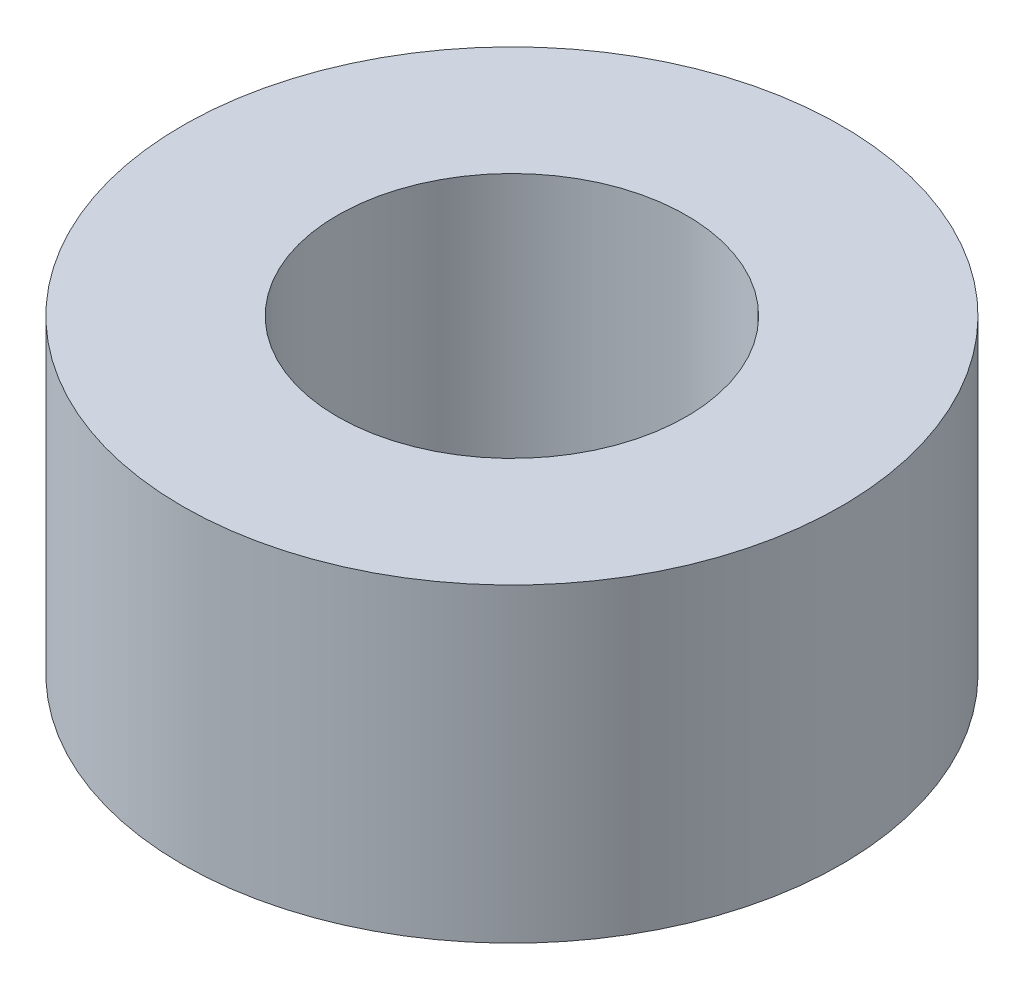
ISO-10303-21;
HEADER;
FILE_DESCRIPTION(('STEP AP214'),'2;1');
FILE_NAME('part.step','',(''),(''),'','','');
FILE_SCHEMA(('AUTOMOTIVE_DESIGN { 1 0 10303 214 1 1 1 1 }'));
ENDSEC;
DATA;
#1=APPLICATION_CONTEXT('core data for automotive mechanical design processes');
#2=APPLICATION_PROTOCOL_DEFINITION('international standard','automotive_design',2000,#1);
#3=PRODUCT_CONTEXT('',#1,'mechanical');
#4=PRODUCT('Part','Part','',(#3));
#5=PRODUCT_RELATED_PRODUCT_CATEGORY('part','',(#4));
#6=PRODUCT_DEFINITION_FORMATION('','',#4);
#7=PRODUCT_DEFINITION_CONTEXT('part definition',#1,'design');
#8=PRODUCT_DEFINITION('design','',#6,#7);
#9=PRODUCT_DEFINITION_SHAPE('','',#8);
#10=(LENGTH_UNIT() NAMED_UNIT(*) SI_UNIT(.MILLI.,.METRE.));
#11=(NAMED_UNIT(*) PLANE_ANGLE_UNIT() SI_UNIT($,.RADIAN.));
#12=(NAMED_UNIT(*) SI_UNIT($,.STERADIAN.) SOLID_ANGLE_UNIT());
#13=UNCERTAINTY_MEASURE_WITH_UNIT(LENGTH_MEASURE(1.E-05),#10,'distance_accuracy_value','');
#14=(GEOMETRIC_REPRESENTATION_CONTEXT(3) GLOBAL_UNCERTAINTY_ASSIGNED_CONTEXT((#13)) GLOBAL_UNIT_ASSIGNED_CONTEXT((#10,
#11,#12)) REPRESENTATION_CONTEXT('',''));
#15=CARTESIAN_POINT('',(0.,0.,0.));
#16=DIRECTION('',(0.,0.,1.));
#17=DIRECTION('',(1.,0.,0.));
#18=AXIS2_PLACEMENT_3D('',#15,#16,#17);
#19=CARTESIAN_POINT('',(0.,4.,0.));
#20=DIRECTION('',(0.,1.,0.));
#21=DIRECTION('',(0.,0.,1.));
#22=AXIS2_PLACEMENT_3D('',#19,#20,#21);
#23=PLANE('',#22);
#24=CARTESIAN_POINT('',(0.,4.,0.));
#25=DIRECTION('',(0.,1.,0.));
#26=DIRECTION('',(0.,0.,1.));
#27=AXIS2_PLACEMENT_3D('',#24,#25,#26);
#28=CIRCLE('',#27,4.25);
#29=CARTESIAN_POINT('',(0.,4.,4.25));
#30=VERTEX_POINT('',#29);
#31=EDGE_CURVE('E10',#30,#30,#28,.T.);
#32=ORIENTED_EDGE('',*,*,#31,.T.);
#33=EDGE_LOOP('',(#32));
#34=FACE_BOUND('',#33,.T.);
#35=CARTESIAN_POINT('',(0.,4.,0.));
#36=DIRECTION('',(0.,1.,0.));
#37=DIRECTION('',(0.,0.,1.));
#38=AXIS2_PLACEMENT_3D('',#35,#36,#37);
#39=CIRCLE('',#38,2.25);
#40=CARTESIAN_POINT('',(0.,4.,2.25));
#41=VERTEX_POINT('',#40);
#42=EDGE_CURVE('E48',#41,#41,#39,.T.);
#43=ORIENTED_EDGE('',*,*,#42,.F.);
#44=EDGE_LOOP('',(#43));
#45=FACE_BOUND('',#44,.T.);
#46=ADVANCED_FACE('F37',(#34,#45),#23,.T.);
#47=CARTESIAN_POINT('',(0.,0.,0.));
#48=DIRECTION('',(0.,1.,0.));
#49=DIRECTION('',(0.,0.,1.));
#50=AXIS2_PLACEMENT_3D('',#47,#48,#49);
#51=PLANE('',#50);
#52=CARTESIAN_POINT('',(0.,0.,0.));
#53=DIRECTION('',(0.,1.,0.));
#54=DIRECTION('',(0.,0.,1.));
#55=AXIS2_PLACEMENT_3D('',#52,#53,#54);
#56=CIRCLE('',#55,4.25);
#57=CARTESIAN_POINT('',(0.,0.,4.25));
#58=VERTEX_POINT('',#57);
#59=EDGE_CURVE('E41',#58,#58,#56,.T.);
#60=ORIENTED_EDGE('',*,*,#59,.F.);
#61=EDGE_LOOP('',(#60));
#62=FACE_BOUND('',#61,.T.);
#63=CARTESIAN_POINT('',(0.,0.,0.));
#64=DIRECTION('',(0.,1.,0.));
#65=DIRECTION('',(0.,0.,1.));
#66=AXIS2_PLACEMENT_3D('',#63,#64,#65);
#67=CIRCLE('',#66,2.25);
#68=CARTESIAN_POINT('',(0.,0.,2.25));
#69=VERTEX_POINT('',#68);
#70=EDGE_CURVE('E50',#69,#69,#67,.T.);
#71=ORIENTED_EDGE('',*,*,#70,.T.);
#72=EDGE_LOOP('',(#71));
#73=FACE_BOUND('',#72,.T.);
#74=ADVANCED_FACE('F60',(#62,#73),#51,.F.);
#75=CARTESIAN_POINT('',(0.,4.,0.));
#76=DIRECTION('',(0.,-1.,0.));
#77=DIRECTION('',(0.,0.,-1.));
#78=AXIS2_PLACEMENT_3D('',#75,#76,#77);
#79=CYLINDRICAL_SURFACE('',#78,4.25);
#80=ORIENTED_EDGE('',*,*,#31,.F.);
#81=EDGE_LOOP('',(#80));
#82=FACE_BOUND('',#81,.T.);
#83=ORIENTED_EDGE('',*,*,#59,.T.);
#84=EDGE_LOOP('',(#83));
#85=FACE_BOUND('',#84,.T.);
#86=ADVANCED_FACE('F39',(#82,#85),#79,.T.);
#87=CARTESIAN_POINT('',(0.,4.,0.));
#88=DIRECTION('',(0.,-1.,0.));
#89=DIRECTION('',(0.,0.,-1.));
#90=AXIS2_PLACEMENT_3D('',#87,#88,#89);
#91=CYLINDRICAL_SURFACE('',#90,2.25);
#92=ORIENTED_EDGE('',*,*,#42,.T.);
#93=EDGE_LOOP('',(#92));
#94=FACE_BOUND('',#93,.T.);
#95=ORIENTED_EDGE('',*,*,#70,.F.);
#96=EDGE_LOOP('',(#95));
#97=FACE_BOUND('',#96,.T.);
#98=ADVANCED_FACE('F56',(#94,#97),#91,.F.);
#99=CLOSED_SHELL('',(#46,#74,#86,#98));
#100=MANIFOLD_SOLID_BREP('B2',#99);
#101=ADVANCED_BREP_SHAPE_REPRESENTATION('',(#18,#100),#14);
#102=SHAPE_DEFINITION_REPRESENTATION(#9,#101);
ENDSEC;
END-ISO-10303-21;
